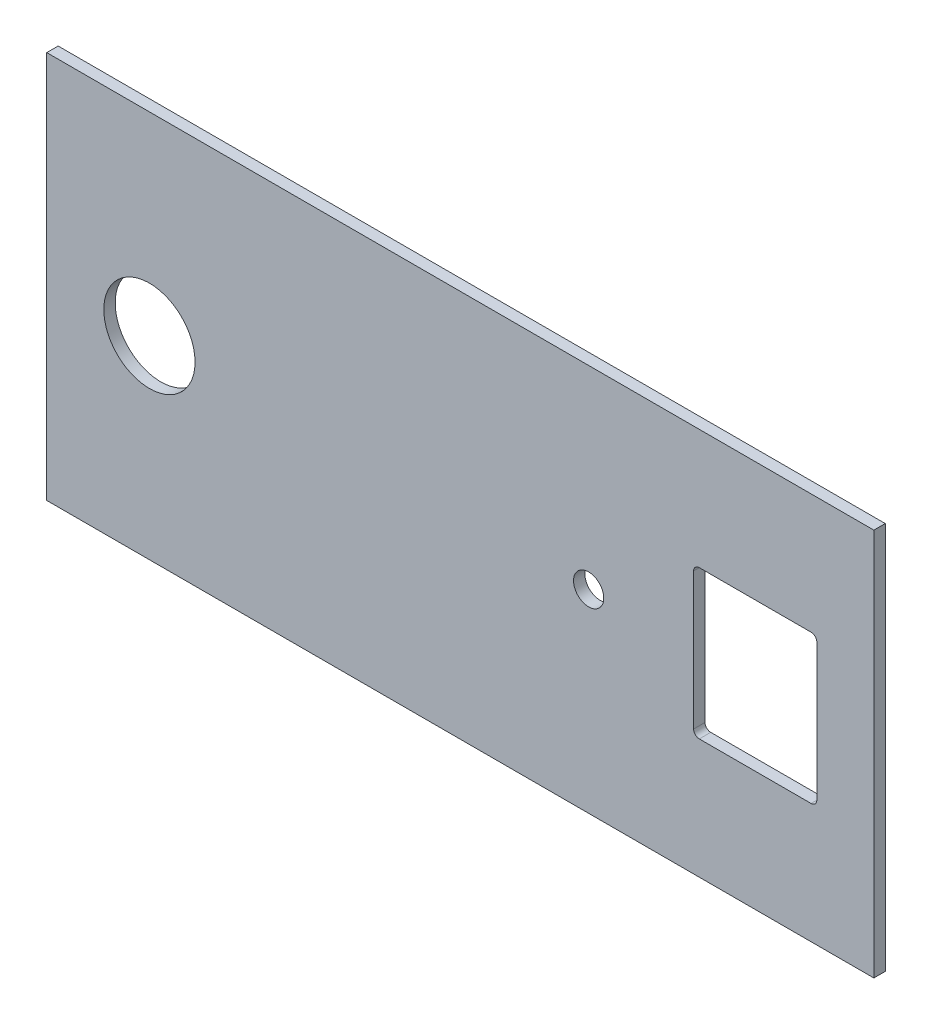
ISO-10303-21;
HEADER;
FILE_DESCRIPTION(('STEP AP214'),'2;1');
FILE_NAME('part.step','',(''),(''),'','','');
FILE_SCHEMA(('AUTOMOTIVE_DESIGN { 1 0 10303 214 1 1 1 1 }'));
ENDSEC;
DATA;
#1=APPLICATION_CONTEXT('core data for automotive mechanical design processes');
#2=APPLICATION_PROTOCOL_DEFINITION('international standard','automotive_design',2000,#1);
#3=PRODUCT_CONTEXT('',#1,'mechanical');
#4=PRODUCT('Part','Part','',(#3));
#5=PRODUCT_RELATED_PRODUCT_CATEGORY('part','',(#4));
#6=PRODUCT_DEFINITION_FORMATION('','',#4);
#7=PRODUCT_DEFINITION_CONTEXT('part definition',#1,'design');
#8=PRODUCT_DEFINITION('design','',#6,#7);
#9=PRODUCT_DEFINITION_SHAPE('','',#8);
#10=(LENGTH_UNIT() NAMED_UNIT(*) SI_UNIT(.MILLI.,.METRE.));
#11=(NAMED_UNIT(*) PLANE_ANGLE_UNIT() SI_UNIT($,.RADIAN.));
#12=(NAMED_UNIT(*) SI_UNIT($,.STERADIAN.) SOLID_ANGLE_UNIT());
#13=UNCERTAINTY_MEASURE_WITH_UNIT(LENGTH_MEASURE(1.E-05),#10,'distance_accuracy_value','');
#14=(GEOMETRIC_REPRESENTATION_CONTEXT(3) GLOBAL_UNCERTAINTY_ASSIGNED_CONTEXT((#13)) GLOBAL_UNIT_ASSIGNED_CONTEXT((#10,
#11,#12)) REPRESENTATION_CONTEXT('',''));
#15=CARTESIAN_POINT('',(0.,0.,0.));
#16=DIRECTION('',(0.,0.,1.));
#17=DIRECTION('',(1.,0.,0.));
#18=AXIS2_PLACEMENT_3D('',#15,#16,#17);
#19=CARTESIAN_POINT('',(-72.5,-34.,2.));
#20=DIRECTION('',(1.,0.,0.));
#21=DIRECTION('',(0.,0.,-1.));
#22=AXIS2_PLACEMENT_3D('',#19,#20,#21);
#23=PLANE('',#22);
#24=DIRECTION('',(0.,-1.,0.));
#25=VECTOR('',#24,1.);
#26=CARTESIAN_POINT('',(-72.5,-34.,0.));
#27=LINE('',#26,#25);
#28=CARTESIAN_POINT('',(-72.5,34.,0.));
#29=VERTEX_POINT('',#28);
#30=CARTESIAN_POINT('',(-72.5,-34.,0.));
#31=VERTEX_POINT('',#30);
#32=EDGE_CURVE('E204',#29,#31,#27,.T.);
#33=ORIENTED_EDGE('',*,*,#32,.T.);
#34=DIRECTION('',(0.,0.,-1.));
#35=VECTOR('',#34,1.);
#36=CARTESIAN_POINT('',(-72.5,-34.,2.));
#37=LINE('',#36,#35);
#38=CARTESIAN_POINT('',(-72.5,-34.,2.));
#39=VERTEX_POINT('',#38);
#40=EDGE_CURVE('E11',#39,#31,#37,.T.);
#41=ORIENTED_EDGE('',*,*,#40,.F.);
#42=DIRECTION('',(0.,-1.,0.));
#43=VECTOR('',#42,1.);
#44=CARTESIAN_POINT('',(-72.5,-34.,2.));
#45=LINE('',#44,#43);
#46=CARTESIAN_POINT('',(-72.5,34.,2.));
#47=VERTEX_POINT('',#46);
#48=EDGE_CURVE('E237',#47,#39,#45,.T.);
#49=ORIENTED_EDGE('',*,*,#48,.F.);
#50=DIRECTION('',(0.,0.,-1.));
#51=VECTOR('',#50,1.);
#52=CARTESIAN_POINT('',(-72.5,34.,2.));
#53=LINE('',#52,#51);
#54=EDGE_CURVE('E251',#47,#29,#53,.T.);
#55=ORIENTED_EDGE('',*,*,#54,.T.);
#56=EDGE_LOOP('',(#33,#41,#49,#55));
#57=FACE_BOUND('',#56,.T.);
#58=ADVANCED_FACE('F39',(#57),#23,.F.);
#59=CARTESIAN_POINT('',(72.5,-34.,2.));
#60=DIRECTION('',(0.,1.,0.));
#61=DIRECTION('',(-1.,0.,0.));
#62=AXIS2_PLACEMENT_3D('',#59,#60,#61);
#63=PLANE('',#62);
#64=DIRECTION('',(1.,0.,0.));
#65=VECTOR('',#64,1.);
#66=CARTESIAN_POINT('',(72.5,-34.,0.));
#67=LINE('',#66,#65);
#68=CARTESIAN_POINT('',(72.5,-34.,0.));
#69=VERTEX_POINT('',#68);
#70=EDGE_CURVE('E255',#31,#69,#67,.T.);
#71=ORIENTED_EDGE('',*,*,#70,.T.);
#72=DIRECTION('',(0.,0.,-1.));
#73=VECTOR('',#72,1.);
#74=CARTESIAN_POINT('',(72.5,-34.,2.));
#75=LINE('',#74,#73);
#76=CARTESIAN_POINT('',(72.5,-34.,2.));
#77=VERTEX_POINT('',#76);
#78=EDGE_CURVE('E47',#77,#69,#75,.T.);
#79=ORIENTED_EDGE('',*,*,#78,.F.);
#80=DIRECTION('',(1.,0.,0.));
#81=VECTOR('',#80,1.);
#82=CARTESIAN_POINT('',(72.5,-34.,2.));
#83=LINE('',#82,#81);
#84=EDGE_CURVE('E241',#39,#77,#83,.T.);
#85=ORIENTED_EDGE('',*,*,#84,.F.);
#86=ORIENTED_EDGE('',*,*,#40,.T.);
#87=EDGE_LOOP('',(#71,#79,#85,#86));
#88=FACE_BOUND('',#87,.T.);
#89=ADVANCED_FACE('F290',(#88),#63,.F.);
#90=CARTESIAN_POINT('',(72.5,-34.,2.));
#91=DIRECTION('',(-1.,0.,0.));
#92=DIRECTION('',(0.,0.,1.));
#93=AXIS2_PLACEMENT_3D('',#90,#91,#92);
#94=PLANE('',#93);
#95=DIRECTION('',(0.,1.,0.));
#96=VECTOR('',#95,1.);
#97=CARTESIAN_POINT('',(72.5,-34.,0.));
#98=LINE('',#97,#96);
#99=CARTESIAN_POINT('',(72.5,34.,0.));
#100=VERTEX_POINT('',#99);
#101=EDGE_CURVE('E258',#69,#100,#98,.T.);
#102=ORIENTED_EDGE('',*,*,#101,.T.);
#103=DIRECTION('',(0.,0.,-1.));
#104=VECTOR('',#103,1.);
#105=CARTESIAN_POINT('',(72.5,34.,2.));
#106=LINE('',#105,#104);
#107=CARTESIAN_POINT('',(72.5,34.,2.));
#108=VERTEX_POINT('',#107);
#109=EDGE_CURVE('E266',#108,#100,#106,.T.);
#110=ORIENTED_EDGE('',*,*,#109,.F.);
#111=DIRECTION('',(0.,1.,0.));
#112=VECTOR('',#111,1.);
#113=CARTESIAN_POINT('',(72.5,-34.,2.));
#114=LINE('',#113,#112);
#115=EDGE_CURVE('E245',#77,#108,#114,.T.);
#116=ORIENTED_EDGE('',*,*,#115,.F.);
#117=ORIENTED_EDGE('',*,*,#78,.T.);
#118=EDGE_LOOP('',(#102,#110,#116,#117));
#119=FACE_BOUND('',#118,.T.);
#120=ADVANCED_FACE('F275',(#119),#94,.F.);
#121=CARTESIAN_POINT('',(72.5,34.,2.));
#122=DIRECTION('',(0.,-1.,0.));
#123=DIRECTION('',(1.,0.,0.));
#124=AXIS2_PLACEMENT_3D('',#121,#122,#123);
#125=PLANE('',#124);
#126=DIRECTION('',(-1.,0.,0.));
#127=VECTOR('',#126,1.);
#128=CARTESIAN_POINT('',(72.5,34.,0.));
#129=LINE('',#128,#127);
#130=EDGE_CURVE('E242',#100,#29,#129,.T.);
#131=ORIENTED_EDGE('',*,*,#130,.T.);
#132=ORIENTED_EDGE('',*,*,#54,.F.);
#133=DIRECTION('',(-1.,0.,0.));
#134=VECTOR('',#133,1.);
#135=CARTESIAN_POINT('',(72.5,34.,2.));
#136=LINE('',#135,#134);
#137=EDGE_CURVE('E248',#108,#47,#136,.T.);
#138=ORIENTED_EDGE('',*,*,#137,.F.);
#139=ORIENTED_EDGE('',*,*,#109,.T.);
#140=EDGE_LOOP('',(#131,#132,#138,#139));
#141=FACE_BOUND('',#140,.T.);
#142=ADVANCED_FACE('F283',(#141),#125,.F.);
#143=CARTESIAN_POINT('',(0.,0.,2.));
#144=DIRECTION('',(0.,0.,1.));
#145=DIRECTION('',(1.,0.,0.));
#146=AXIS2_PLACEMENT_3D('',#143,#144,#145);
#147=PLANE('',#146);
#148=CARTESIAN_POINT('',(61.5,12.,2.));
#149=DIRECTION('',(0.,0.,1.));
#150=DIRECTION('',(1.,0.,0.));
#151=AXIS2_PLACEMENT_3D('',#148,#149,#150);
#152=CIRCLE('',#151,1.);
#153=CARTESIAN_POINT('',(62.5,12.,2.));
#154=VERTEX_POINT('',#153);
#155=CARTESIAN_POINT('',(61.5,13.,2.));
#156=VERTEX_POINT('',#155);
#157=EDGE_CURVE('E54',#154,#156,#152,.T.);
#158=ORIENTED_EDGE('',*,*,#157,.F.);
#159=DIRECTION('',(0.,1.,0.));
#160=VECTOR('',#159,1.);
#161=CARTESIAN_POINT('',(62.5,-12.,2.));
#162=LINE('',#161,#160);
#163=CARTESIAN_POINT('',(62.5,-12.,2.));
#164=VERTEX_POINT('',#163);
#165=EDGE_CURVE('E150',#164,#154,#162,.T.);
#166=ORIENTED_EDGE('',*,*,#165,.F.);
#167=CARTESIAN_POINT('',(61.5,-12.,2.));
#168=DIRECTION('',(0.,0.,1.));
#169=DIRECTION('',(1.,0.,0.));
#170=AXIS2_PLACEMENT_3D('',#167,#168,#169);
#171=CIRCLE('',#170,1.);
#172=CARTESIAN_POINT('',(61.5,-13.,2.));
#173=VERTEX_POINT('',#172);
#174=EDGE_CURVE('E154',#173,#164,#171,.T.);
#175=ORIENTED_EDGE('',*,*,#174,.F.);
#176=DIRECTION('',(1.,0.,0.));
#177=VECTOR('',#176,1.);
#178=CARTESIAN_POINT('',(61.5,-13.,2.));
#179=LINE('',#178,#177);
#180=CARTESIAN_POINT('',(41.9,-13.,2.));
#181=VERTEX_POINT('',#180);
#182=EDGE_CURVE('E194',#181,#173,#179,.T.);
#183=ORIENTED_EDGE('',*,*,#182,.F.);
#184=CARTESIAN_POINT('',(41.9,-12.,2.));
#185=DIRECTION('',(0.,0.,1.));
#186=DIRECTION('',(-1.,0.,0.));
#187=AXIS2_PLACEMENT_3D('',#184,#185,#186);
#188=CIRCLE('',#187,1.);
#189=CARTESIAN_POINT('',(40.9,-12.,2.));
#190=VERTEX_POINT('',#189);
#191=EDGE_CURVE('E190',#190,#181,#188,.T.);
#192=ORIENTED_EDGE('',*,*,#191,.F.);
#193=DIRECTION('',(0.,-1.,0.));
#194=VECTOR('',#193,1.);
#195=CARTESIAN_POINT('',(40.9,-12.,2.));
#196=LINE('',#195,#194);
#197=CARTESIAN_POINT('',(40.9,12.,2.));
#198=VERTEX_POINT('',#197);
#199=EDGE_CURVE('E186',#198,#190,#196,.T.);
#200=ORIENTED_EDGE('',*,*,#199,.F.);
#201=CARTESIAN_POINT('',(41.9,12.,2.));
#202=DIRECTION('',(0.,0.,1.));
#203=DIRECTION('',(1.,0.,0.));
#204=AXIS2_PLACEMENT_3D('',#201,#202,#203);
#205=CIRCLE('',#204,1.);
#206=CARTESIAN_POINT('',(41.9,13.,2.));
#207=VERTEX_POINT('',#206);
#208=EDGE_CURVE('E182',#207,#198,#205,.T.);
#209=ORIENTED_EDGE('',*,*,#208,.F.);
#210=DIRECTION('',(-1.,0.,0.));
#211=VECTOR('',#210,1.);
#212=CARTESIAN_POINT('',(61.5,13.,2.));
#213=LINE('',#212,#211);
#214=EDGE_CURVE('E178',#156,#207,#213,.T.);
#215=ORIENTED_EDGE('',*,*,#214,.F.);
#216=EDGE_LOOP('',(#158,#166,#175,#183,#192,#200,#209,#215));
#217=FACE_BOUND('',#216,.T.);
#218=CARTESIAN_POINT('',(-54.5,0.,2.));
#219=DIRECTION('',(0.,0.,1.));
#220=DIRECTION('',(1.,0.,0.));
#221=AXIS2_PLACEMENT_3D('',#218,#219,#220);
#222=CIRCLE('',#221,8.);
#223=CARTESIAN_POINT('',(-46.5,0.,2.));
#224=VERTEX_POINT('',#223);
#225=EDGE_CURVE('E225',#224,#224,#222,.T.);
#226=ORIENTED_EDGE('',*,*,#225,.F.);
#227=EDGE_LOOP('',(#226));
#228=FACE_BOUND('',#227,.T.);
#229=CARTESIAN_POINT('',(22.5,0.,2.));
#230=DIRECTION('',(0.,0.,1.));
#231=DIRECTION('',(1.,0.,0.));
#232=AXIS2_PLACEMENT_3D('',#229,#230,#231);
#233=CIRCLE('',#232,2.65);
#234=CARTESIAN_POINT('',(25.15,0.,2.));
#235=VERTEX_POINT('',#234);
#236=EDGE_CURVE('E233',#235,#235,#233,.T.);
#237=ORIENTED_EDGE('',*,*,#236,.F.);
#238=EDGE_LOOP('',(#237));
#239=FACE_BOUND('',#238,.T.);
#240=ORIENTED_EDGE('',*,*,#48,.T.);
#241=ORIENTED_EDGE('',*,*,#84,.T.);
#242=ORIENTED_EDGE('',*,*,#115,.T.);
#243=ORIENTED_EDGE('',*,*,#137,.T.);
#244=EDGE_LOOP('',(#240,#241,#242,#243));
#245=FACE_BOUND('',#244,.T.);
#246=ADVANCED_FACE('F289',(#217,#228,#239,#245),#147,.T.);
#247=CARTESIAN_POINT('',(0.,0.,0.));
#248=DIRECTION('',(0.,0.,1.));
#249=DIRECTION('',(1.,0.,0.));
#250=AXIS2_PLACEMENT_3D('',#247,#248,#249);
#251=PLANE('',#250);
#252=DIRECTION('',(0.,1.,0.));
#253=VECTOR('',#252,1.);
#254=CARTESIAN_POINT('',(62.5,-12.,0.));
#255=LINE('',#254,#253);
#256=CARTESIAN_POINT('',(62.5,-12.,0.));
#257=VERTEX_POINT('',#256);
#258=CARTESIAN_POINT('',(62.5,12.,0.));
#259=VERTEX_POINT('',#258);
#260=EDGE_CURVE('E137',#257,#259,#255,.T.);
#261=ORIENTED_EDGE('',*,*,#260,.T.);
#262=CARTESIAN_POINT('',(61.5,12.,0.));
#263=DIRECTION('',(0.,0.,1.));
#264=DIRECTION('',(1.,0.,0.));
#265=AXIS2_PLACEMENT_3D('',#262,#263,#264);
#266=CIRCLE('',#265,1.);
#267=CARTESIAN_POINT('',(61.5,13.,0.));
#268=VERTEX_POINT('',#267);
#269=EDGE_CURVE('E130',#259,#268,#266,.T.);
#270=ORIENTED_EDGE('',*,*,#269,.T.);
#271=DIRECTION('',(-1.,0.,0.));
#272=VECTOR('',#271,1.);
#273=CARTESIAN_POINT('',(61.5,13.,0.));
#274=LINE('',#273,#272);
#275=CARTESIAN_POINT('',(41.9,13.,0.));
#276=VERTEX_POINT('',#275);
#277=EDGE_CURVE('E140',#268,#276,#274,.T.);
#278=ORIENTED_EDGE('',*,*,#277,.T.);
#279=CARTESIAN_POINT('',(41.9,12.,0.));
#280=DIRECTION('',(0.,0.,1.));
#281=DIRECTION('',(1.,0.,0.));
#282=AXIS2_PLACEMENT_3D('',#279,#280,#281);
#283=CIRCLE('',#282,1.);
#284=CARTESIAN_POINT('',(40.9,12.,0.));
#285=VERTEX_POINT('',#284);
#286=EDGE_CURVE('E62',#276,#285,#283,.T.);
#287=ORIENTED_EDGE('',*,*,#286,.T.);
#288=DIRECTION('',(0.,-1.,0.));
#289=VECTOR('',#288,1.);
#290=CARTESIAN_POINT('',(40.9,-12.,0.));
#291=LINE('',#290,#289);
#292=CARTESIAN_POINT('',(40.9,-12.,0.));
#293=VERTEX_POINT('',#292);
#294=EDGE_CURVE('E159',#285,#293,#291,.T.);
#295=ORIENTED_EDGE('',*,*,#294,.T.);
#296=CARTESIAN_POINT('',(41.9,-12.,0.));
#297=DIRECTION('',(0.,0.,1.));
#298=DIRECTION('',(-1.,0.,0.));
#299=AXIS2_PLACEMENT_3D('',#296,#297,#298);
#300=CIRCLE('',#299,1.);
#301=CARTESIAN_POINT('',(41.9,-13.,0.));
#302=VERTEX_POINT('',#301);
#303=EDGE_CURVE('E163',#293,#302,#300,.T.);
#304=ORIENTED_EDGE('',*,*,#303,.T.);
#305=DIRECTION('',(1.,0.,0.));
#306=VECTOR('',#305,1.);
#307=CARTESIAN_POINT('',(61.5,-13.,0.));
#308=LINE('',#307,#306);
#309=CARTESIAN_POINT('',(61.5,-13.,0.));
#310=VERTEX_POINT('',#309);
#311=EDGE_CURVE('E167',#302,#310,#308,.T.);
#312=ORIENTED_EDGE('',*,*,#311,.T.);
#313=CARTESIAN_POINT('',(61.5,-12.,0.));
#314=DIRECTION('',(0.,0.,1.));
#315=DIRECTION('',(1.,0.,0.));
#316=AXIS2_PLACEMENT_3D('',#313,#314,#315);
#317=CIRCLE('',#316,1.);
#318=EDGE_CURVE('E171',#310,#257,#317,.T.);
#319=ORIENTED_EDGE('',*,*,#318,.T.);
#320=EDGE_LOOP('',(#261,#270,#278,#287,#295,#304,#312,#319));
#321=FACE_BOUND('',#320,.T.);
#322=CARTESIAN_POINT('',(-54.5,0.,0.));
#323=DIRECTION('',(0.,0.,1.));
#324=DIRECTION('',(1.,0.,0.));
#325=AXIS2_PLACEMENT_3D('',#322,#323,#324);
#326=CIRCLE('',#325,8.);
#327=CARTESIAN_POINT('',(-46.5,0.,0.));
#328=VERTEX_POINT('',#327);
#329=EDGE_CURVE('E179',#328,#328,#326,.T.);
#330=ORIENTED_EDGE('',*,*,#329,.T.);
#331=EDGE_LOOP('',(#330));
#332=FACE_BOUND('',#331,.T.);
#333=CARTESIAN_POINT('',(22.5,0.,0.));
#334=DIRECTION('',(0.,0.,1.));
#335=DIRECTION('',(1.,0.,0.));
#336=AXIS2_PLACEMENT_3D('',#333,#334,#335);
#337=CIRCLE('',#336,2.65);
#338=CARTESIAN_POINT('',(25.15,0.,0.));
#339=VERTEX_POINT('',#338);
#340=EDGE_CURVE('E229',#339,#339,#337,.T.);
#341=ORIENTED_EDGE('',*,*,#340,.T.);
#342=EDGE_LOOP('',(#341));
#343=FACE_BOUND('',#342,.T.);
#344=ORIENTED_EDGE('',*,*,#32,.F.);
#345=ORIENTED_EDGE('',*,*,#130,.F.);
#346=ORIENTED_EDGE('',*,*,#101,.F.);
#347=ORIENTED_EDGE('',*,*,#70,.F.);
#348=EDGE_LOOP('',(#344,#345,#346,#347));
#349=FACE_BOUND('',#348,.T.);
#350=ADVANCED_FACE('F145',(#321,#332,#343,#349),#251,.F.);
#351=CARTESIAN_POINT('',(22.5,0.,0.));
#352=DIRECTION('',(0.,0.,1.));
#353=DIRECTION('',(1.,0.,0.));
#354=AXIS2_PLACEMENT_3D('',#351,#352,#353);
#355=CYLINDRICAL_SURFACE('',#354,2.65);
#356=ORIENTED_EDGE('',*,*,#340,.F.);
#357=EDGE_LOOP('',(#356));
#358=FACE_BOUND('',#357,.T.);
#359=ORIENTED_EDGE('',*,*,#236,.T.);
#360=EDGE_LOOP('',(#359));
#361=FACE_BOUND('',#360,.T.);
#362=ADVANCED_FACE('F302',(#358,#361),#355,.F.);
#363=CARTESIAN_POINT('',(-54.5,0.,0.));
#364=DIRECTION('',(0.,0.,1.));
#365=DIRECTION('',(1.,0.,0.));
#366=AXIS2_PLACEMENT_3D('',#363,#364,#365);
#367=CYLINDRICAL_SURFACE('',#366,8.);
#368=ORIENTED_EDGE('',*,*,#329,.F.);
#369=EDGE_LOOP('',(#368));
#370=FACE_BOUND('',#369,.T.);
#371=ORIENTED_EDGE('',*,*,#225,.T.);
#372=EDGE_LOOP('',(#371));
#373=FACE_BOUND('',#372,.T.);
#374=ADVANCED_FACE('F308',(#370,#373),#367,.F.);
#375=CARTESIAN_POINT('',(61.5,12.,0.));
#376=DIRECTION('',(0.,0.,1.));
#377=DIRECTION('',(1.,0.,0.));
#378=AXIS2_PLACEMENT_3D('',#375,#376,#377);
#379=CYLINDRICAL_SURFACE('',#378,1.);
#380=ORIENTED_EDGE('',*,*,#157,.T.);
#381=DIRECTION('',(0.,0.,1.));
#382=VECTOR('',#381,1.);
#383=CARTESIAN_POINT('',(61.5,13.,0.));
#384=LINE('',#383,#382);
#385=EDGE_CURVE('E126',#268,#156,#384,.T.);
#386=ORIENTED_EDGE('',*,*,#385,.F.);
#387=ORIENTED_EDGE('',*,*,#269,.F.);
#388=DIRECTION('',(0.,0.,1.));
#389=VECTOR('',#388,1.);
#390=CARTESIAN_POINT('',(62.5,12.,0.));
#391=LINE('',#390,#389);
#392=EDGE_CURVE('E201',#259,#154,#391,.T.);
#393=ORIENTED_EDGE('',*,*,#392,.T.);
#394=EDGE_LOOP('',(#380,#386,#387,#393));
#395=FACE_BOUND('',#394,.T.);
#396=ADVANCED_FACE('F128',(#395),#379,.F.);
#397=CARTESIAN_POINT('',(62.5,-12.,0.));
#398=DIRECTION('',(1.,0.,0.));
#399=DIRECTION('',(0.,0.,-1.));
#400=AXIS2_PLACEMENT_3D('',#397,#398,#399);
#401=PLANE('',#400);
#402=ORIENTED_EDGE('',*,*,#165,.T.);
#403=ORIENTED_EDGE('',*,*,#392,.F.);
#404=ORIENTED_EDGE('',*,*,#260,.F.);
#405=DIRECTION('',(0.,0.,1.));
#406=VECTOR('',#405,1.);
#407=CARTESIAN_POINT('',(62.5,-12.,0.));
#408=LINE('',#407,#406);
#409=EDGE_CURVE('E205',#257,#164,#408,.T.);
#410=ORIENTED_EDGE('',*,*,#409,.T.);
#411=EDGE_LOOP('',(#402,#403,#404,#410));
#412=FACE_BOUND('',#411,.T.);
#413=ADVANCED_FACE('F315',(#412),#401,.F.);
#414=CARTESIAN_POINT('',(61.5,-12.,0.));
#415=DIRECTION('',(0.,0.,1.));
#416=DIRECTION('',(1.,0.,0.));
#417=AXIS2_PLACEMENT_3D('',#414,#415,#416);
#418=CYLINDRICAL_SURFACE('',#417,1.);
#419=ORIENTED_EDGE('',*,*,#174,.T.);
#420=ORIENTED_EDGE('',*,*,#409,.F.);
#421=ORIENTED_EDGE('',*,*,#318,.F.);
#422=DIRECTION('',(0.,0.,1.));
#423=VECTOR('',#422,1.);
#424=CARTESIAN_POINT('',(61.5,-13.,0.));
#425=LINE('',#424,#423);
#426=EDGE_CURVE('E208',#310,#173,#425,.T.);
#427=ORIENTED_EDGE('',*,*,#426,.T.);
#428=EDGE_LOOP('',(#419,#420,#421,#427));
#429=FACE_BOUND('',#428,.T.);
#430=ADVANCED_FACE('F332',(#429),#418,.F.);
#431=CARTESIAN_POINT('',(61.5,-13.,0.));
#432=DIRECTION('',(0.,-1.,0.));
#433=DIRECTION('',(1.,0.,0.));
#434=AXIS2_PLACEMENT_3D('',#431,#432,#433);
#435=PLANE('',#434);
#436=ORIENTED_EDGE('',*,*,#182,.T.);
#437=ORIENTED_EDGE('',*,*,#426,.F.);
#438=ORIENTED_EDGE('',*,*,#311,.F.);
#439=DIRECTION('',(0.,0.,1.));
#440=VECTOR('',#439,1.);
#441=CARTESIAN_POINT('',(41.9,-13.,0.));
#442=LINE('',#441,#440);
#443=EDGE_CURVE('E211',#302,#181,#442,.T.);
#444=ORIENTED_EDGE('',*,*,#443,.T.);
#445=EDGE_LOOP('',(#436,#437,#438,#444));
#446=FACE_BOUND('',#445,.T.);
#447=ADVANCED_FACE('F328',(#446),#435,.F.);
#448=CARTESIAN_POINT('',(41.9,-12.,0.));
#449=DIRECTION('',(0.,0.,1.));
#450=DIRECTION('',(1.,0.,0.));
#451=AXIS2_PLACEMENT_3D('',#448,#449,#450);
#452=CYLINDRICAL_SURFACE('',#451,1.);
#453=ORIENTED_EDGE('',*,*,#191,.T.);
#454=ORIENTED_EDGE('',*,*,#443,.F.);
#455=ORIENTED_EDGE('',*,*,#303,.F.);
#456=DIRECTION('',(0.,0.,1.));
#457=VECTOR('',#456,1.);
#458=CARTESIAN_POINT('',(40.9,-12.,0.));
#459=LINE('',#458,#457);
#460=EDGE_CURVE('E214',#293,#190,#459,.T.);
#461=ORIENTED_EDGE('',*,*,#460,.T.);
#462=EDGE_LOOP('',(#453,#454,#455,#461));
#463=FACE_BOUND('',#462,.T.);
#464=ADVANCED_FACE('F324',(#463),#452,.F.);
#465=CARTESIAN_POINT('',(40.9,-12.,0.));
#466=DIRECTION('',(-1.,0.,0.));
#467=DIRECTION('',(0.,0.,1.));
#468=AXIS2_PLACEMENT_3D('',#465,#466,#467);
#469=PLANE('',#468);
#470=ORIENTED_EDGE('',*,*,#199,.T.);
#471=ORIENTED_EDGE('',*,*,#460,.F.);
#472=ORIENTED_EDGE('',*,*,#294,.F.);
#473=DIRECTION('',(0.,0.,1.));
#474=VECTOR('',#473,1.);
#475=CARTESIAN_POINT('',(40.9,12.,0.));
#476=LINE('',#475,#474);
#477=EDGE_CURVE('E217',#285,#198,#476,.T.);
#478=ORIENTED_EDGE('',*,*,#477,.T.);
#479=EDGE_LOOP('',(#470,#471,#472,#478));
#480=FACE_BOUND('',#479,.T.);
#481=ADVANCED_FACE('F321',(#480),#469,.F.);
#482=CARTESIAN_POINT('',(41.9,12.,0.));
#483=DIRECTION('',(0.,0.,1.));
#484=DIRECTION('',(1.,0.,0.));
#485=AXIS2_PLACEMENT_3D('',#482,#483,#484);
#486=CYLINDRICAL_SURFACE('',#485,1.);
#487=ORIENTED_EDGE('',*,*,#208,.T.);
#488=ORIENTED_EDGE('',*,*,#477,.F.);
#489=ORIENTED_EDGE('',*,*,#286,.F.);
#490=DIRECTION('',(0.,0.,1.));
#491=VECTOR('',#490,1.);
#492=CARTESIAN_POINT('',(41.9,13.,0.));
#493=LINE('',#492,#491);
#494=EDGE_CURVE('E136',#276,#207,#493,.T.);
#495=ORIENTED_EDGE('',*,*,#494,.T.);
#496=EDGE_LOOP('',(#487,#488,#489,#495));
#497=FACE_BOUND('',#496,.T.);
#498=ADVANCED_FACE('F318',(#497),#486,.F.);
#499=CARTESIAN_POINT('',(61.5,13.,0.));
#500=DIRECTION('',(0.,1.,0.));
#501=DIRECTION('',(-1.,0.,0.));
#502=AXIS2_PLACEMENT_3D('',#499,#500,#501);
#503=PLANE('',#502);
#504=ORIENTED_EDGE('',*,*,#214,.T.);
#505=ORIENTED_EDGE('',*,*,#494,.F.);
#506=ORIENTED_EDGE('',*,*,#277,.F.);
#507=ORIENTED_EDGE('',*,*,#385,.T.);
#508=EDGE_LOOP('',(#504,#505,#506,#507));
#509=FACE_BOUND('',#508,.T.);
#510=ADVANCED_FACE('F141',(#509),#503,.F.);
#511=CLOSED_SHELL('',(#58,#89,#120,#142,#246,#350,#362,#374,#396,#413,#430,#447,#464,#481,#498,#510));
#512=MANIFOLD_SOLID_BREP('B2',#511);
#513=ADVANCED_BREP_SHAPE_REPRESENTATION('',(#18,#512),#14);
#514=SHAPE_DEFINITION_REPRESENTATION(#9,#513);
ENDSEC;
END-ISO-10303-21;
